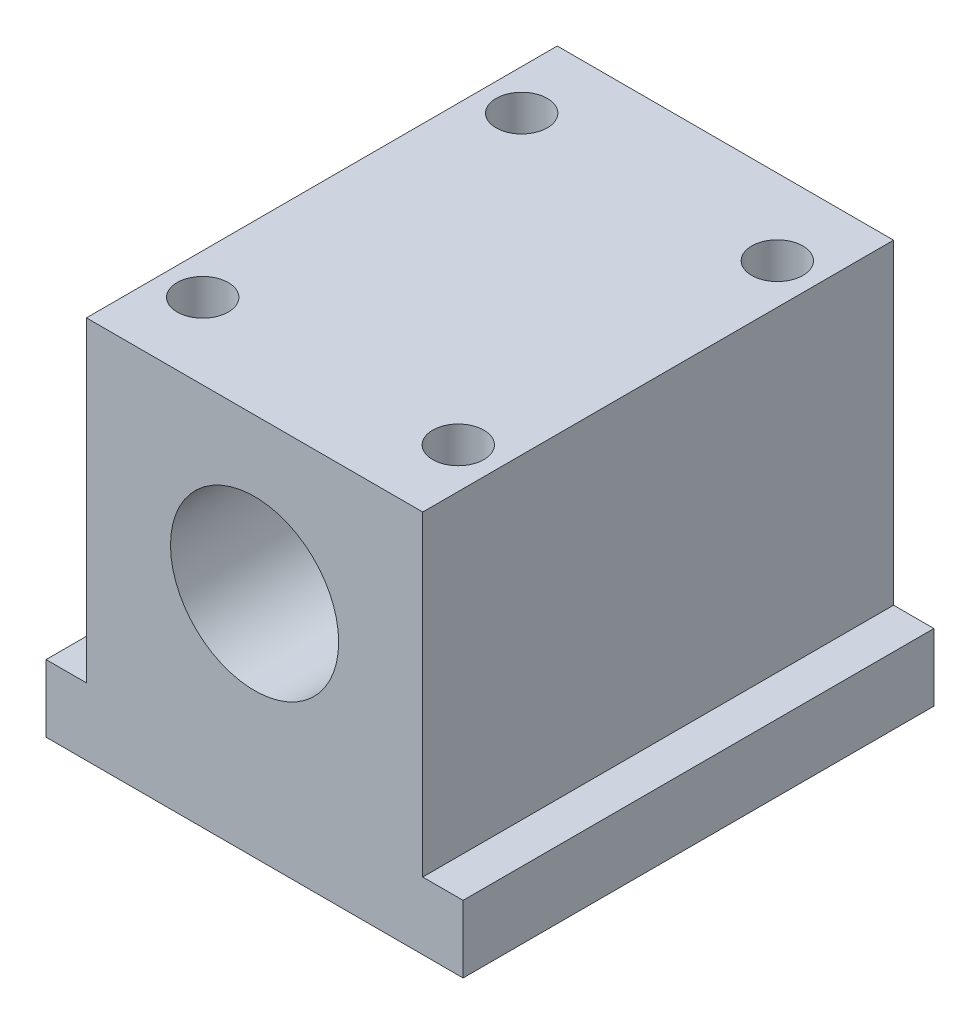
ISO-10303-21;
HEADER;
FILE_DESCRIPTION(('STEP AP214'),'2;1');
FILE_NAME('part.step','',(''),(''),'','','');
FILE_SCHEMA(('AUTOMOTIVE_DESIGN { 1 0 10303 214 1 1 1 1 }'));
ENDSEC;
DATA;
#1=APPLICATION_CONTEXT('core data for automotive mechanical design processes');
#2=APPLICATION_PROTOCOL_DEFINITION('international standard','automotive_design',2000,#1);
#3=PRODUCT_CONTEXT('',#1,'mechanical');
#4=PRODUCT('Part','Part','',(#3));
#5=PRODUCT_RELATED_PRODUCT_CATEGORY('part','',(#4));
#6=PRODUCT_DEFINITION_FORMATION('','',#4);
#7=PRODUCT_DEFINITION_CONTEXT('part definition',#1,'design');
#8=PRODUCT_DEFINITION('design','',#6,#7);
#9=PRODUCT_DEFINITION_SHAPE('','',#8);
#10=(LENGTH_UNIT() NAMED_UNIT(*) SI_UNIT(.MILLI.,.METRE.));
#11=(NAMED_UNIT(*) PLANE_ANGLE_UNIT() SI_UNIT($,.RADIAN.));
#12=(NAMED_UNIT(*) SI_UNIT($,.STERADIAN.) SOLID_ANGLE_UNIT());
#13=UNCERTAINTY_MEASURE_WITH_UNIT(LENGTH_MEASURE(1.E-05),#10,'distance_accuracy_value','');
#14=(GEOMETRIC_REPRESENTATION_CONTEXT(3) GLOBAL_UNCERTAINTY_ASSIGNED_CONTEXT((#13)) GLOBAL_UNIT_ASSIGNED_CONTEXT((#10,
#11,#12)) REPRESENTATION_CONTEXT('',''));
#15=CARTESIAN_POINT('',(0.,0.,0.));
#16=DIRECTION('',(0.,0.,1.));
#17=DIRECTION('',(1.,0.,0.));
#18=AXIS2_PLACEMENT_3D('',#15,#16,#17);
#19=CARTESIAN_POINT('',(0.,0.,70.));
#20=DIRECTION('',(0.,0.,-1.));
#21=DIRECTION('',(-1.,0.,0.));
#22=AXIS2_PLACEMENT_3D('',#19,#20,#21);
#23=PLANE('',#22);
#24=DIRECTION('',(0.,1.,0.));
#25=VECTOR('',#24,1.);
#26=CARTESIAN_POINT('',(31.,-29.0346244402382,70.));
#27=LINE('',#26,#25);
#28=CARTESIAN_POINT('',(31.,-29.0346244402382,70.));
#29=VERTEX_POINT('',#28);
#30=CARTESIAN_POINT('',(31.,-19.0346244402382,70.));
#31=VERTEX_POINT('',#30);
#32=EDGE_CURVE('E145',#29,#31,#27,.T.);
#33=ORIENTED_EDGE('',*,*,#32,.T.);
#34=DIRECTION('',(-1.,0.,0.));
#35=VECTOR('',#34,1.);
#36=CARTESIAN_POINT('',(25.,-19.0346244402382,70.));
#37=LINE('',#36,#35);
#38=CARTESIAN_POINT('',(25.,-19.0346244402382,70.));
#39=VERTEX_POINT('',#38);
#40=EDGE_CURVE('E93',#31,#39,#37,.T.);
#41=ORIENTED_EDGE('',*,*,#40,.T.);
#42=DIRECTION('',(0.,1.,0.));
#43=VECTOR('',#42,1.);
#44=CARTESIAN_POINT('',(25.,27.9653755597618,70.));
#45=LINE('',#44,#43);
#46=CARTESIAN_POINT('',(25.,27.9653755597618,70.));
#47=VERTEX_POINT('',#46);
#48=EDGE_CURVE('E160',#39,#47,#45,.T.);
#49=ORIENTED_EDGE('',*,*,#48,.T.);
#50=DIRECTION('',(-1.,0.,0.));
#51=VECTOR('',#50,1.);
#52=CARTESIAN_POINT('',(-25.,27.9653755597618,70.));
#53=LINE('',#52,#51);
#54=CARTESIAN_POINT('',(-25.,27.9653755597618,70.));
#55=VERTEX_POINT('',#54);
#56=EDGE_CURVE('E173',#47,#55,#53,.T.);
#57=ORIENTED_EDGE('',*,*,#56,.T.);
#58=DIRECTION('',(0.,-1.,0.));
#59=VECTOR('',#58,1.);
#60=CARTESIAN_POINT('',(-25.,27.9653755597618,70.));
#61=LINE('',#60,#59);
#62=CARTESIAN_POINT('',(-25.,-19.0346244402382,70.));
#63=VERTEX_POINT('',#62);
#64=EDGE_CURVE('E112',#55,#63,#61,.T.);
#65=ORIENTED_EDGE('',*,*,#64,.T.);
#66=DIRECTION('',(-1.,0.,0.));
#67=VECTOR('',#66,1.);
#68=CARTESIAN_POINT('',(-31.,-19.0346244402382,70.));
#69=LINE('',#68,#67);
#70=CARTESIAN_POINT('',(-31.,-19.0346244402382,70.));
#71=VERTEX_POINT('',#70);
#72=EDGE_CURVE('E106',#63,#71,#69,.T.);
#73=ORIENTED_EDGE('',*,*,#72,.T.);
#74=DIRECTION('',(0.,-1.,0.));
#75=VECTOR('',#74,1.);
#76=CARTESIAN_POINT('',(-31.,-29.0346244402382,70.));
#77=LINE('',#76,#75);
#78=CARTESIAN_POINT('',(-31.,-29.0346244402382,70.));
#79=VERTEX_POINT('',#78);
#80=EDGE_CURVE('E110',#71,#79,#77,.T.);
#81=ORIENTED_EDGE('',*,*,#80,.T.);
#82=DIRECTION('',(1.,0.,0.));
#83=VECTOR('',#82,1.);
#84=CARTESIAN_POINT('',(-31.,-29.0346244402382,70.));
#85=LINE('',#84,#83);
#86=EDGE_CURVE('E50',#79,#29,#85,.T.);
#87=ORIENTED_EDGE('',*,*,#86,.T.);
#88=EDGE_LOOP('',(#33,#41,#49,#57,#65,#73,#81,#87));
#89=FACE_BOUND('',#88,.T.);
#90=CARTESIAN_POINT('',(0.,4.96537555976177,70.));
#91=DIRECTION('',(0.,0.,1.));
#92=DIRECTION('',(1.,0.,0.));
#93=AXIS2_PLACEMENT_3D('',#90,#91,#92);
#94=CIRCLE('',#93,12.5);
#95=CARTESIAN_POINT('',(12.5,4.96537555976177,70.));
#96=VERTEX_POINT('',#95);
#97=EDGE_CURVE('E134',#96,#96,#94,.T.);
#98=ORIENTED_EDGE('',*,*,#97,.F.);
#99=EDGE_LOOP('',(#98));
#100=FACE_BOUND('',#99,.T.);
#101=ADVANCED_FACE('F33',(#89,#100),#23,.F.);
#102=CARTESIAN_POINT('',(0.,0.,0.));
#103=DIRECTION('',(0.,0.,-1.));
#104=DIRECTION('',(-1.,0.,0.));
#105=AXIS2_PLACEMENT_3D('',#102,#103,#104);
#106=PLANE('',#105);
#107=DIRECTION('',(0.,1.,0.));
#108=VECTOR('',#107,1.);
#109=CARTESIAN_POINT('',(31.,-29.0346244402382,0.));
#110=LINE('',#109,#108);
#111=CARTESIAN_POINT('',(31.,-29.0346244402382,0.));
#112=VERTEX_POINT('',#111);
#113=CARTESIAN_POINT('',(31.,-19.0346244402382,0.));
#114=VERTEX_POINT('',#113);
#115=EDGE_CURVE('E130',#112,#114,#110,.T.);
#116=ORIENTED_EDGE('',*,*,#115,.F.);
#117=DIRECTION('',(1.,0.,0.));
#118=VECTOR('',#117,1.);
#119=CARTESIAN_POINT('',(-31.,-29.0346244402382,0.));
#120=LINE('',#119,#118);
#121=CARTESIAN_POINT('',(-31.,-29.0346244402382,0.));
#122=VERTEX_POINT('',#121);
#123=EDGE_CURVE('E85',#122,#112,#120,.T.);
#124=ORIENTED_EDGE('',*,*,#123,.F.);
#125=DIRECTION('',(0.,-1.,0.));
#126=VECTOR('',#125,1.);
#127=CARTESIAN_POINT('',(-31.,-29.0346244402382,0.));
#128=LINE('',#127,#126);
#129=CARTESIAN_POINT('',(-31.,-19.0346244402382,0.));
#130=VERTEX_POINT('',#129);
#131=EDGE_CURVE('E79',#130,#122,#128,.T.);
#132=ORIENTED_EDGE('',*,*,#131,.F.);
#133=DIRECTION('',(-1.,0.,0.));
#134=VECTOR('',#133,1.);
#135=CARTESIAN_POINT('',(-31.,-19.0346244402382,0.));
#136=LINE('',#135,#134);
#137=CARTESIAN_POINT('',(-25.,-19.0346244402382,0.));
#138=VERTEX_POINT('',#137);
#139=EDGE_CURVE('E120',#138,#130,#136,.T.);
#140=ORIENTED_EDGE('',*,*,#139,.F.);
#141=DIRECTION('',(0.,-1.,0.));
#142=VECTOR('',#141,1.);
#143=CARTESIAN_POINT('',(-25.,27.9653755597618,0.));
#144=LINE('',#143,#142);
#145=CARTESIAN_POINT('',(-25.,27.9653755597618,0.));
#146=VERTEX_POINT('',#145);
#147=EDGE_CURVE('E140',#146,#138,#144,.T.);
#148=ORIENTED_EDGE('',*,*,#147,.F.);
#149=DIRECTION('',(-1.,0.,0.));
#150=VECTOR('',#149,1.);
#151=CARTESIAN_POINT('',(-25.,27.9653755597618,0.));
#152=LINE('',#151,#150);
#153=CARTESIAN_POINT('',(25.,27.9653755597618,0.));
#154=VERTEX_POINT('',#153);
#155=EDGE_CURVE('E138',#154,#146,#152,.T.);
#156=ORIENTED_EDGE('',*,*,#155,.F.);
#157=DIRECTION('',(0.,1.,0.));
#158=VECTOR('',#157,1.);
#159=CARTESIAN_POINT('',(25.,27.9653755597618,0.));
#160=LINE('',#159,#158);
#161=CARTESIAN_POINT('',(25.,-19.0346244402382,0.));
#162=VERTEX_POINT('',#161);
#163=EDGE_CURVE('E136',#162,#154,#160,.T.);
#164=ORIENTED_EDGE('',*,*,#163,.F.);
#165=DIRECTION('',(-1.,0.,0.));
#166=VECTOR('',#165,1.);
#167=CARTESIAN_POINT('',(25.,-19.0346244402382,0.));
#168=LINE('',#167,#166);
#169=EDGE_CURVE('E133',#114,#162,#168,.T.);
#170=ORIENTED_EDGE('',*,*,#169,.F.);
#171=EDGE_LOOP('',(#116,#124,#132,#140,#148,#156,#164,#170));
#172=FACE_BOUND('',#171,.T.);
#173=CARTESIAN_POINT('',(0.,4.96537555976177,0.));
#174=DIRECTION('',(0.,0.,1.));
#175=DIRECTION('',(1.,0.,0.));
#176=AXIS2_PLACEMENT_3D('',#173,#174,#175);
#177=CIRCLE('',#176,12.5);
#178=CARTESIAN_POINT('',(12.5,4.96537555976177,0.));
#179=VERTEX_POINT('',#178);
#180=EDGE_CURVE('E179',#179,#179,#177,.T.);
#181=ORIENTED_EDGE('',*,*,#180,.T.);
#182=EDGE_LOOP('',(#181));
#183=FACE_BOUND('',#182,.T.);
#184=ADVANCED_FACE('F164',(#172,#183),#106,.T.);
#185=CARTESIAN_POINT('',(31.,-29.0346244402382,70.));
#186=DIRECTION('',(-1.,0.,0.));
#187=DIRECTION('',(0.,-1.,0.));
#188=AXIS2_PLACEMENT_3D('',#185,#186,#187);
#189=PLANE('',#188);
#190=ORIENTED_EDGE('',*,*,#115,.T.);
#191=DIRECTION('',(0.,0.,-1.));
#192=VECTOR('',#191,1.);
#193=CARTESIAN_POINT('',(31.,-19.0346244402382,70.));
#194=LINE('',#193,#192);
#195=EDGE_CURVE('E11',#31,#114,#194,.T.);
#196=ORIENTED_EDGE('',*,*,#195,.F.);
#197=ORIENTED_EDGE('',*,*,#32,.F.);
#198=DIRECTION('',(0.,0.,-1.));
#199=VECTOR('',#198,1.);
#200=CARTESIAN_POINT('',(31.,-29.0346244402382,70.));
#201=LINE('',#200,#199);
#202=EDGE_CURVE('E126',#29,#112,#201,.T.);
#203=ORIENTED_EDGE('',*,*,#202,.T.);
#204=EDGE_LOOP('',(#190,#196,#197,#203));
#205=FACE_BOUND('',#204,.T.);
#206=ADVANCED_FACE('F35',(#205),#189,.F.);
#207=CARTESIAN_POINT('',(25.,-19.0346244402382,70.));
#208=DIRECTION('',(0.,-1.,0.));
#209=DIRECTION('',(1.,0.,0.));
#210=AXIS2_PLACEMENT_3D('',#207,#208,#209);
#211=PLANE('',#210);
#212=ORIENTED_EDGE('',*,*,#169,.T.);
#213=DIRECTION('',(0.,0.,-1.));
#214=VECTOR('',#213,1.);
#215=CARTESIAN_POINT('',(25.,-19.0346244402382,70.));
#216=LINE('',#215,#214);
#217=EDGE_CURVE('E42',#39,#162,#216,.T.);
#218=ORIENTED_EDGE('',*,*,#217,.F.);
#219=ORIENTED_EDGE('',*,*,#40,.F.);
#220=ORIENTED_EDGE('',*,*,#195,.T.);
#221=EDGE_LOOP('',(#212,#218,#219,#220));
#222=FACE_BOUND('',#221,.T.);
#223=ADVANCED_FACE('F260',(#222),#211,.F.);
#224=CARTESIAN_POINT('',(25.,27.9653755597618,70.));
#225=DIRECTION('',(-1.,0.,0.));
#226=DIRECTION('',(0.,-1.,0.));
#227=AXIS2_PLACEMENT_3D('',#224,#225,#226);
#228=PLANE('',#227);
#229=ORIENTED_EDGE('',*,*,#163,.T.);
#230=DIRECTION('',(0.,0.,-1.));
#231=VECTOR('',#230,1.);
#232=CARTESIAN_POINT('',(25.,27.9653755597618,70.));
#233=LINE('',#232,#231);
#234=EDGE_CURVE('E152',#47,#154,#233,.T.);
#235=ORIENTED_EDGE('',*,*,#234,.F.);
#236=ORIENTED_EDGE('',*,*,#48,.F.);
#237=ORIENTED_EDGE('',*,*,#217,.T.);
#238=EDGE_LOOP('',(#229,#235,#236,#237));
#239=FACE_BOUND('',#238,.T.);
#240=ADVANCED_FACE('F158',(#239),#228,.F.);
#241=CARTESIAN_POINT('',(-25.,27.9653755597618,70.));
#242=DIRECTION('',(0.,-1.,0.));
#243=DIRECTION('',(1.,0.,0.));
#244=AXIS2_PLACEMENT_3D('',#241,#242,#243);
#245=PLANE('',#244);
#246=CARTESIAN_POINT('',(19.,27.9653755597618,11.2853691647083));
#247=DIRECTION('',(0.,1.,0.));
#248=DIRECTION('',(1.,0.,0.));
#249=AXIS2_PLACEMENT_3D('',#246,#247,#248);
#250=CIRCLE('',#249,3.8050135634373);
#251=CARTESIAN_POINT('',(22.8050135634373,27.9653755597618,11.2853691647083));
#252=VERTEX_POINT('',#251);
#253=EDGE_CURVE('E203',#252,#252,#250,.T.);
#254=ORIENTED_EDGE('',*,*,#253,.F.);
#255=EDGE_LOOP('',(#254));
#256=FACE_BOUND('',#255,.T.);
#257=CARTESIAN_POINT('',(-19.,27.9653755597618,11.2853691647083));
#258=DIRECTION('',(0.,1.,0.));
#259=DIRECTION('',(-1.,0.,0.));
#260=AXIS2_PLACEMENT_3D('',#257,#258,#259);
#261=CIRCLE('',#260,3.8050135634373);
#262=CARTESIAN_POINT('',(-22.8050135634373,27.9653755597618,11.2853691647083));
#263=VERTEX_POINT('',#262);
#264=EDGE_CURVE('E197',#263,#263,#261,.T.);
#265=ORIENTED_EDGE('',*,*,#264,.F.);
#266=EDGE_LOOP('',(#265));
#267=FACE_BOUND('',#266,.T.);
#268=CARTESIAN_POINT('',(19.,27.9653755597618,58.7146308352917));
#269=DIRECTION('',(0.,1.,0.));
#270=DIRECTION('',(-1.,0.,0.));
#271=AXIS2_PLACEMENT_3D('',#268,#269,#270);
#272=CIRCLE('',#271,3.80501356343729);
#273=CARTESIAN_POINT('',(15.1949864365627,27.9653755597618,58.7146308352917));
#274=VERTEX_POINT('',#273);
#275=EDGE_CURVE('E192',#274,#274,#272,.T.);
#276=ORIENTED_EDGE('',*,*,#275,.F.);
#277=EDGE_LOOP('',(#276));
#278=FACE_BOUND('',#277,.T.);
#279=CARTESIAN_POINT('',(-19.,27.9653755597618,58.7146308352917));
#280=DIRECTION('',(0.,1.,0.));
#281=DIRECTION('',(1.,0.,0.));
#282=AXIS2_PLACEMENT_3D('',#279,#280,#281);
#283=CIRCLE('',#282,3.80501356343729);
#284=CARTESIAN_POINT('',(-15.1949864365627,27.9653755597618,58.7146308352917));
#285=VERTEX_POINT('',#284);
#286=EDGE_CURVE('E185',#285,#285,#283,.T.);
#287=ORIENTED_EDGE('',*,*,#286,.F.);
#288=EDGE_LOOP('',(#287));
#289=FACE_BOUND('',#288,.T.);
#290=ORIENTED_EDGE('',*,*,#155,.T.);
#291=DIRECTION('',(0.,0.,-1.));
#292=VECTOR('',#291,1.);
#293=CARTESIAN_POINT('',(-25.,27.9653755597618,70.));
#294=LINE('',#293,#292);
#295=EDGE_CURVE('E149',#55,#146,#294,.T.);
#296=ORIENTED_EDGE('',*,*,#295,.F.);
#297=ORIENTED_EDGE('',*,*,#56,.F.);
#298=ORIENTED_EDGE('',*,*,#234,.T.);
#299=EDGE_LOOP('',(#290,#296,#297,#298));
#300=FACE_BOUND('',#299,.T.);
#301=ADVANCED_FACE('F169',(#256,#267,#278,#289,#300),#245,.F.);
#302=CARTESIAN_POINT('',(-25.,27.9653755597618,70.));
#303=DIRECTION('',(1.,0.,0.));
#304=DIRECTION('',(0.,1.,0.));
#305=AXIS2_PLACEMENT_3D('',#302,#303,#304);
#306=PLANE('',#305);
#307=ORIENTED_EDGE('',*,*,#147,.T.);
#308=DIRECTION('',(0.,0.,-1.));
#309=VECTOR('',#308,1.);
#310=CARTESIAN_POINT('',(-25.,-19.0346244402382,70.));
#311=LINE('',#310,#309);
#312=EDGE_CURVE('E121',#63,#138,#311,.T.);
#313=ORIENTED_EDGE('',*,*,#312,.F.);
#314=ORIENTED_EDGE('',*,*,#64,.F.);
#315=ORIENTED_EDGE('',*,*,#295,.T.);
#316=EDGE_LOOP('',(#307,#313,#314,#315));
#317=FACE_BOUND('',#316,.T.);
#318=ADVANCED_FACE('F172',(#317),#306,.F.);
#319=CARTESIAN_POINT('',(-31.,-19.0346244402382,70.));
#320=DIRECTION('',(0.,-1.,0.));
#321=DIRECTION('',(1.,0.,0.));
#322=AXIS2_PLACEMENT_3D('',#319,#320,#321);
#323=PLANE('',#322);
#324=ORIENTED_EDGE('',*,*,#139,.T.);
#325=DIRECTION('',(0.,0.,-1.));
#326=VECTOR('',#325,1.);
#327=CARTESIAN_POINT('',(-31.,-19.0346244402382,70.));
#328=LINE('',#327,#326);
#329=EDGE_CURVE('E117',#71,#130,#328,.T.);
#330=ORIENTED_EDGE('',*,*,#329,.F.);
#331=ORIENTED_EDGE('',*,*,#72,.F.);
#332=ORIENTED_EDGE('',*,*,#312,.T.);
#333=EDGE_LOOP('',(#324,#330,#331,#332));
#334=FACE_BOUND('',#333,.T.);
#335=ADVANCED_FACE('F118',(#334),#323,.F.);
#336=CARTESIAN_POINT('',(-31.,-29.0346244402382,70.));
#337=DIRECTION('',(1.,0.,0.));
#338=DIRECTION('',(0.,1.,0.));
#339=AXIS2_PLACEMENT_3D('',#336,#337,#338);
#340=PLANE('',#339);
#341=ORIENTED_EDGE('',*,*,#131,.T.);
#342=DIRECTION('',(0.,0.,-1.));
#343=VECTOR('',#342,1.);
#344=CARTESIAN_POINT('',(-31.,-29.0346244402382,70.));
#345=LINE('',#344,#343);
#346=EDGE_CURVE('E122',#79,#122,#345,.T.);
#347=ORIENTED_EDGE('',*,*,#346,.F.);
#348=ORIENTED_EDGE('',*,*,#80,.F.);
#349=ORIENTED_EDGE('',*,*,#329,.T.);
#350=EDGE_LOOP('',(#341,#347,#348,#349));
#351=FACE_BOUND('',#350,.T.);
#352=ADVANCED_FACE('F124',(#351),#340,.F.);
#353=CARTESIAN_POINT('',(-31.,-29.0346244402382,70.));
#354=DIRECTION('',(0.,1.,0.));
#355=DIRECTION('',(0.,0.,1.));
#356=AXIS2_PLACEMENT_3D('',#353,#354,#355);
#357=PLANE('',#356);
#358=ORIENTED_EDGE('',*,*,#123,.T.);
#359=ORIENTED_EDGE('',*,*,#202,.F.);
#360=ORIENTED_EDGE('',*,*,#86,.F.);
#361=ORIENTED_EDGE('',*,*,#346,.T.);
#362=EDGE_LOOP('',(#358,#359,#360,#361));
#363=FACE_BOUND('',#362,.T.);
#364=ADVANCED_FACE('F240',(#363),#357,.F.);
#365=CARTESIAN_POINT('',(0.,4.96537555976177,70.));
#366=DIRECTION('',(0.,0.,-1.));
#367=DIRECTION('',(-1.,0.,0.));
#368=AXIS2_PLACEMENT_3D('',#365,#366,#367);
#369=CYLINDRICAL_SURFACE('',#368,12.5);
#370=ORIENTED_EDGE('',*,*,#97,.T.);
#371=EDGE_LOOP('',(#370));
#372=FACE_BOUND('',#371,.T.);
#373=ORIENTED_EDGE('',*,*,#180,.F.);
#374=EDGE_LOOP('',(#373));
#375=FACE_BOUND('',#374,.T.);
#376=ADVANCED_FACE('F230',(#372,#375),#369,.F.);
#377=CARTESIAN_POINT('',(-19.,4.96537555976177,58.7146308352917));
#378=DIRECTION('',(0.,1.,0.));
#379=DIRECTION('',(-1.,0.,0.));
#380=AXIS2_PLACEMENT_3D('',#377,#378,#379);
#381=CYLINDRICAL_SURFACE('',#380,3.80501356343729);
#382=CARTESIAN_POINT('',(-19.,4.96537555976177,58.7146308352917));
#383=DIRECTION('',(0.,1.,0.));
#384=DIRECTION('',(1.,0.,0.));
#385=AXIS2_PLACEMENT_3D('',#382,#383,#384);
#386=CIRCLE('',#385,3.80501356343729);
#387=CARTESIAN_POINT('',(-15.1949864365627,4.96537555976177,58.7146308352917));
#388=VERTEX_POINT('',#387);
#389=EDGE_CURVE('E188',#388,#388,#386,.T.);
#390=ORIENTED_EDGE('',*,*,#389,.F.);
#391=EDGE_LOOP('',(#390));
#392=FACE_BOUND('',#391,.T.);
#393=ORIENTED_EDGE('',*,*,#286,.T.);
#394=EDGE_LOOP('',(#393));
#395=FACE_BOUND('',#394,.T.);
#396=ADVANCED_FACE('F227',(#392,#395),#381,.F.);
#397=CARTESIAN_POINT('',(-19.,4.96537555976177,58.7146308352917));
#398=DIRECTION('',(0.,-1.,0.));
#399=DIRECTION('',(1.,0.,0.));
#400=AXIS2_PLACEMENT_3D('',#397,#398,#399);
#401=PLANE('',#400);
#402=ORIENTED_EDGE('',*,*,#389,.T.);
#403=EDGE_LOOP('',(#402));
#404=FACE_BOUND('',#403,.T.);
#405=ADVANCED_FACE('F229',(#404),#401,.F.);
#406=CARTESIAN_POINT('',(19.,4.96537555976177,58.7146308352917));
#407=DIRECTION('',(0.,1.,0.));
#408=DIRECTION('',(-1.,0.,0.));
#409=AXIS2_PLACEMENT_3D('',#406,#407,#408);
#410=CYLINDRICAL_SURFACE('',#409,3.80501356343729);
#411=CARTESIAN_POINT('',(19.,4.96537555976177,58.7146308352917));
#412=DIRECTION('',(0.,1.,0.));
#413=DIRECTION('',(-1.,0.,0.));
#414=AXIS2_PLACEMENT_3D('',#411,#412,#413);
#415=CIRCLE('',#414,3.80501356343729);
#416=CARTESIAN_POINT('',(15.1949864365627,4.96537555976177,58.7146308352917));
#417=VERTEX_POINT('',#416);
#418=EDGE_CURVE('E182',#417,#417,#415,.T.);
#419=ORIENTED_EDGE('',*,*,#418,.F.);
#420=EDGE_LOOP('',(#419));
#421=FACE_BOUND('',#420,.T.);
#422=ORIENTED_EDGE('',*,*,#275,.T.);
#423=EDGE_LOOP('',(#422));
#424=FACE_BOUND('',#423,.T.);
#425=ADVANCED_FACE('F237',(#421,#424),#410,.F.);
#426=CARTESIAN_POINT('',(19.,4.96537555976177,58.7146308352917));
#427=DIRECTION('',(0.,1.,0.));
#428=DIRECTION('',(-1.,0.,0.));
#429=AXIS2_PLACEMENT_3D('',#426,#427,#428);
#430=PLANE('',#429);
#431=ORIENTED_EDGE('',*,*,#418,.T.);
#432=EDGE_LOOP('',(#431));
#433=FACE_BOUND('',#432,.T.);
#434=ADVANCED_FACE('F340',(#433),#430,.T.);
#435=CARTESIAN_POINT('',(-19.,15.9653755597618,11.2853691647083));
#436=DIRECTION('',(0.,1.,0.));
#437=DIRECTION('',(-1.,0.,0.));
#438=AXIS2_PLACEMENT_3D('',#435,#436,#437);
#439=CYLINDRICAL_SURFACE('',#438,3.8050135634373);
#440=CARTESIAN_POINT('',(-19.,15.9653755597618,11.2853691647083));
#441=DIRECTION('',(0.,1.,0.));
#442=DIRECTION('',(-1.,0.,0.));
#443=AXIS2_PLACEMENT_3D('',#440,#441,#442);
#444=CIRCLE('',#443,3.8050135634373);
#445=CARTESIAN_POINT('',(-22.8050135634373,15.9653755597618,11.2853691647083));
#446=VERTEX_POINT('',#445);
#447=EDGE_CURVE('E200',#446,#446,#444,.T.);
#448=ORIENTED_EDGE('',*,*,#447,.F.);
#449=EDGE_LOOP('',(#448));
#450=FACE_BOUND('',#449,.T.);
#451=ORIENTED_EDGE('',*,*,#264,.T.);
#452=EDGE_LOOP('',(#451));
#453=FACE_BOUND('',#452,.T.);
#454=ADVANCED_FACE('F348',(#450,#453),#439,.F.);
#455=CARTESIAN_POINT('',(-19.,15.9653755597618,11.2853691647083));
#456=DIRECTION('',(0.,1.,0.));
#457=DIRECTION('',(-1.,0.,0.));
#458=AXIS2_PLACEMENT_3D('',#455,#456,#457);
#459=PLANE('',#458);
#460=ORIENTED_EDGE('',*,*,#447,.T.);
#461=EDGE_LOOP('',(#460));
#462=FACE_BOUND('',#461,.T.);
#463=ADVANCED_FACE('F214',(#462),#459,.T.);
#464=CARTESIAN_POINT('',(19.,15.9653755597618,11.2853691647083));
#465=DIRECTION('',(0.,1.,0.));
#466=DIRECTION('',(-1.,0.,0.));
#467=AXIS2_PLACEMENT_3D('',#464,#465,#466);
#468=CYLINDRICAL_SURFACE('',#467,3.8050135634373);
#469=CARTESIAN_POINT('',(19.,15.9653755597618,11.2853691647083));
#470=DIRECTION('',(0.,1.,0.));
#471=DIRECTION('',(1.,0.,0.));
#472=AXIS2_PLACEMENT_3D('',#469,#470,#471);
#473=CIRCLE('',#472,3.8050135634373);
#474=CARTESIAN_POINT('',(22.8050135634373,15.9653755597618,11.2853691647083));
#475=VERTEX_POINT('',#474);
#476=EDGE_CURVE('E189',#475,#475,#473,.T.);
#477=ORIENTED_EDGE('',*,*,#476,.F.);
#478=EDGE_LOOP('',(#477));
#479=FACE_BOUND('',#478,.T.);
#480=ORIENTED_EDGE('',*,*,#253,.T.);
#481=EDGE_LOOP('',(#480));
#482=FACE_BOUND('',#481,.T.);
#483=ADVANCED_FACE('F211',(#479,#482),#468,.F.);
#484=CARTESIAN_POINT('',(19.,15.9653755597618,11.2853691647083));
#485=DIRECTION('',(0.,-1.,0.));
#486=DIRECTION('',(1.,0.,0.));
#487=AXIS2_PLACEMENT_3D('',#484,#485,#486);
#488=PLANE('',#487);
#489=ORIENTED_EDGE('',*,*,#476,.T.);
#490=EDGE_LOOP('',(#489));
#491=FACE_BOUND('',#490,.T.);
#492=ADVANCED_FACE('F209',(#491),#488,.F.);
#493=CLOSED_SHELL('',(#101,#184,#206,#223,#240,#301,#318,#335,#352,#364,#376,#396,#405,#425,
#434,#454,#463,#483,#492));
#494=MANIFOLD_SOLID_BREP('B2',#493);
#495=ADVANCED_BREP_SHAPE_REPRESENTATION('',(#18,#494),#14);
#496=SHAPE_DEFINITION_REPRESENTATION(#9,#495);
ENDSEC;
END-ISO-10303-21;
